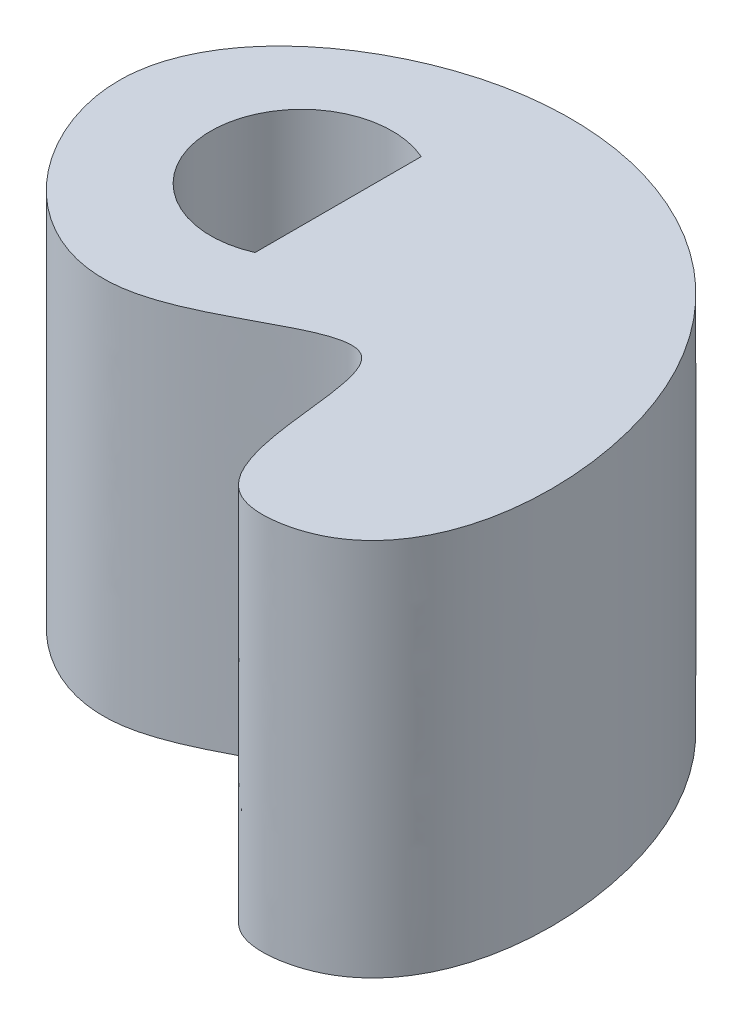
ISO-10303-21;
HEADER;
FILE_DESCRIPTION(('STEP AP214'),'2;1');
FILE_NAME('part.step','',(''),(''),'','','');
FILE_SCHEMA(('AUTOMOTIVE_DESIGN { 1 0 10303 214 1 1 1 1 }'));
ENDSEC;
DATA;
#1=APPLICATION_CONTEXT('core data for automotive mechanical design processes');
#2=APPLICATION_PROTOCOL_DEFINITION('international standard','automotive_design',2000,#1);
#3=PRODUCT_CONTEXT('',#1,'mechanical');
#4=PRODUCT('Part','Part','',(#3));
#5=PRODUCT_RELATED_PRODUCT_CATEGORY('part','',(#4));
#6=PRODUCT_DEFINITION_FORMATION('','',#4);
#7=PRODUCT_DEFINITION_CONTEXT('part definition',#1,'design');
#8=PRODUCT_DEFINITION('design','',#6,#7);
#9=PRODUCT_DEFINITION_SHAPE('','',#8);
#10=(LENGTH_UNIT() NAMED_UNIT(*) SI_UNIT(.MILLI.,.METRE.));
#11=(NAMED_UNIT(*) PLANE_ANGLE_UNIT() SI_UNIT($,.RADIAN.));
#12=(NAMED_UNIT(*) SI_UNIT($,.STERADIAN.) SOLID_ANGLE_UNIT());
#13=UNCERTAINTY_MEASURE_WITH_UNIT(LENGTH_MEASURE(1.E-05),#10,'distance_accuracy_value','');
#14=(GEOMETRIC_REPRESENTATION_CONTEXT(3) GLOBAL_UNCERTAINTY_ASSIGNED_CONTEXT((#13)) GLOBAL_UNIT_ASSIGNED_CONTEXT((#10,
#11,#12)) REPRESENTATION_CONTEXT('',''));
#15=CARTESIAN_POINT('',(0.,0.,0.));
#16=DIRECTION('',(0.,0.,1.));
#17=DIRECTION('',(1.,0.,0.));
#18=AXIS2_PLACEMENT_3D('',#15,#16,#17);
#19=CARTESIAN_POINT('',(6.36818356779855,6.3,3.32651849023443));
#20=DIRECTION('',(0.,1.,0.));
#21=DIRECTION('',(0.,0.,1.));
#22=AXIS2_PLACEMENT_3D('',#19,#20,#21);
#23=PLANE('',#22);
#24=CARTESIAN_POINT('',(-3.,6.3,0.));
#25=CARTESIAN_POINT('',(-3.02322666796111,6.3,1.45344068381636));
#26=CARTESIAN_POINT('',(-0.561402622069291,6.3,4.53647722286951));
#27=CARTESIAN_POINT('',(3.83086424186517,6.3,0.30138574952068));
#28=CARTESIAN_POINT('',(3.02638221633484,6.3,5.2346257881594));
#29=CARTESIAN_POINT('',(6.67777271470007,6.3,4.95395576821967));
#30=CARTESIAN_POINT('',(6.90932520150059,6.3,-1.54088596523216));
#31=CARTESIAN_POINT('',(0.783824636929652,6.3,-4.39712269546271));
#32=CARTESIAN_POINT('',(-2.97677333203889,6.3,-1.45344068381636));
#33=CARTESIAN_POINT('',(-3.,6.3,0.));
#34=B_SPLINE_CURVE_WITH_KNOTS('',3,(#24,#25,#26,#27,#28,#29,#30,#31,#32,#33),.UNSPECIFIED.,.T.,
.F.,(4,1,1,1,1,1,1,4),(0.,0.153623907306187,0.268128407208107,0.382632907110027,
0.418842409312886,0.603475367622747,0.846376092693813,1.),.UNSPECIFIED.);
#35=CARTESIAN_POINT('',(-3.,6.3,0.));
#36=VERTEX_POINT('',#35);
#37=EDGE_CURVE('E11',#36,#36,#34,.T.);
#38=ORIENTED_EDGE('',*,*,#37,.T.);
#39=EDGE_LOOP('',(#38));
#40=FACE_BOUND('',#39,.T.);
#41=DIRECTION('',(0.,0.,-1.));
#42=VECTOR('',#41,1.);
#43=CARTESIAN_POINT('',(0.609188600062337,6.3,-1.38166177104025));
#44=LINE('',#43,#42);
#45=CARTESIAN_POINT('',(0.609188600062337,6.3,1.38166177104025));
#46=VERTEX_POINT('',#45);
#47=CARTESIAN_POINT('',(0.609188600062337,6.3,-1.38166177104025));
#48=VERTEX_POINT('',#47);
#49=EDGE_CURVE('E82',#46,#48,#44,.T.);
#50=ORIENTED_EDGE('',*,*,#49,.F.);
#51=CARTESIAN_POINT('',(0.,6.3,0.));
#52=DIRECTION('',(0.,1.,0.));
#53=DIRECTION('',(0.,0.,1.));
#54=AXIS2_PLACEMENT_3D('',#51,#52,#53);
#55=CIRCLE('',#54,1.51);
#56=EDGE_CURVE('E73',#48,#46,#55,.T.);
#57=ORIENTED_EDGE('',*,*,#56,.F.);
#58=EDGE_LOOP('',(#50,#57));
#59=FACE_BOUND('',#58,.T.);
#60=ADVANCED_FACE('F39',(#40,#59),#23,.T.);
#61=CARTESIAN_POINT('',(6.36818356779855,0.,3.32651849023443));
#62=DIRECTION('',(0.,1.,0.));
#63=DIRECTION('',(0.,0.,1.));
#64=AXIS2_PLACEMENT_3D('',#61,#62,#63);
#65=PLANE('',#64);
#66=CARTESIAN_POINT('',(-3.,0.,0.));
#67=CARTESIAN_POINT('',(-3.02322666796111,0.,1.45344068381636));
#68=CARTESIAN_POINT('',(-0.561402622069291,0.,4.53647722286951));
#69=CARTESIAN_POINT('',(3.83086424186517,0.,0.30138574952068));
#70=CARTESIAN_POINT('',(3.02638221633484,0.,5.2346257881594));
#71=CARTESIAN_POINT('',(6.67777271470007,0.,4.95395576821967));
#72=CARTESIAN_POINT('',(6.90932520150059,0.,-1.54088596523216));
#73=CARTESIAN_POINT('',(0.783824636929652,0.,-4.39712269546271));
#74=CARTESIAN_POINT('',(-2.97677333203889,0.,-1.45344068381636));
#75=CARTESIAN_POINT('',(-3.,0.,0.));
#76=B_SPLINE_CURVE_WITH_KNOTS('',3,(#66,#67,#68,#69,#70,#71,#72,#73,#74,#75),.UNSPECIFIED.,.T.,
.F.,(4,1,1,1,1,1,1,4),(0.,0.153623907306187,0.268128407208107,0.382632907110027,
0.418842409312886,0.603475367622747,0.846376092693813,1.),.UNSPECIFIED.);
#77=CARTESIAN_POINT('',(-3.,0.,0.));
#78=VERTEX_POINT('',#77);
#79=EDGE_CURVE('E44',#78,#78,#76,.T.);
#80=ORIENTED_EDGE('',*,*,#79,.F.);
#81=EDGE_LOOP('',(#80));
#82=FACE_BOUND('',#81,.T.);
#83=CARTESIAN_POINT('',(0.,0.,0.));
#84=DIRECTION('',(0.,1.,0.));
#85=DIRECTION('',(0.,0.,1.));
#86=AXIS2_PLACEMENT_3D('',#83,#84,#85);
#87=CIRCLE('',#86,1.51);
#88=CARTESIAN_POINT('',(0.609188600062337,0.,-1.38166177104025));
#89=VERTEX_POINT('',#88);
#90=CARTESIAN_POINT('',(0.609188600062337,0.,1.38166177104025));
#91=VERTEX_POINT('',#90);
#92=EDGE_CURVE('E63',#89,#91,#87,.T.);
#93=ORIENTED_EDGE('',*,*,#92,.T.);
#94=DIRECTION('',(0.,0.,-1.));
#95=VECTOR('',#94,1.);
#96=CARTESIAN_POINT('',(0.609188600062337,0.,-1.38166177104025));
#97=LINE('',#96,#95);
#98=EDGE_CURVE('E69',#91,#89,#97,.T.);
#99=ORIENTED_EDGE('',*,*,#98,.T.);
#100=EDGE_LOOP('',(#93,#99));
#101=FACE_BOUND('',#100,.T.);
#102=ADVANCED_FACE('F79',(#82,#101),#65,.F.);
#103=DIRECTION('',(0.,-1.,0.));
#104=VECTOR('',#103,1.);
#105=SURFACE_OF_LINEAR_EXTRUSION('',#34,#104);
#106=ORIENTED_EDGE('',*,*,#37,.F.);
#107=EDGE_LOOP('',(#106));
#108=FACE_BOUND('',#107,.T.);
#109=ORIENTED_EDGE('',*,*,#79,.T.);
#110=EDGE_LOOP('',(#109));
#111=FACE_BOUND('',#110,.T.);
#112=ADVANCED_FACE('F41',(#108,#111),#105,.F.);
#113=CARTESIAN_POINT('',(0.,6.3,0.));
#114=DIRECTION('',(0.,-1.,0.));
#115=DIRECTION('',(0.,0.,-1.));
#116=AXIS2_PLACEMENT_3D('',#113,#114,#115);
#117=CYLINDRICAL_SURFACE('',#116,1.51);
#118=ORIENTED_EDGE('',*,*,#92,.F.);
#119=DIRECTION('',(0.,-1.,0.));
#120=VECTOR('',#119,1.);
#121=CARTESIAN_POINT('',(0.609188600062337,6.3,-1.38166177104025));
#122=LINE('',#121,#120);
#123=EDGE_CURVE('E71',#48,#89,#122,.T.);
#124=ORIENTED_EDGE('',*,*,#123,.F.);
#125=ORIENTED_EDGE('',*,*,#56,.T.);
#126=DIRECTION('',(0.,-1.,0.));
#127=VECTOR('',#126,1.);
#128=CARTESIAN_POINT('',(0.609188600062337,6.3,1.38166177104025));
#129=LINE('',#128,#127);
#130=EDGE_CURVE('E56',#46,#91,#129,.T.);
#131=ORIENTED_EDGE('',*,*,#130,.T.);
#132=EDGE_LOOP('',(#118,#124,#125,#131));
#133=FACE_BOUND('',#132,.T.);
#134=ADVANCED_FACE('F75',(#133),#117,.F.);
#135=CARTESIAN_POINT('',(0.609188600062337,6.3,-1.38166177104025));
#136=DIRECTION('',(-1.,0.,0.));
#137=DIRECTION('',(0.,0.,1.));
#138=AXIS2_PLACEMENT_3D('',#135,#136,#137);
#139=PLANE('',#138);
#140=ORIENTED_EDGE('',*,*,#98,.F.);
#141=ORIENTED_EDGE('',*,*,#130,.F.);
#142=ORIENTED_EDGE('',*,*,#49,.T.);
#143=ORIENTED_EDGE('',*,*,#123,.T.);
#144=EDGE_LOOP('',(#140,#141,#142,#143));
#145=FACE_BOUND('',#144,.T.);
#146=ADVANCED_FACE('F70',(#145),#139,.T.);
#147=CLOSED_SHELL('',(#60,#102,#112,#134,#146));
#148=MANIFOLD_SOLID_BREP('B2',#147);
#149=ADVANCED_BREP_SHAPE_REPRESENTATION('',(#18,#148),#14);
#150=SHAPE_DEFINITION_REPRESENTATION(#9,#149);
ENDSEC;
END-ISO-10303-21;
